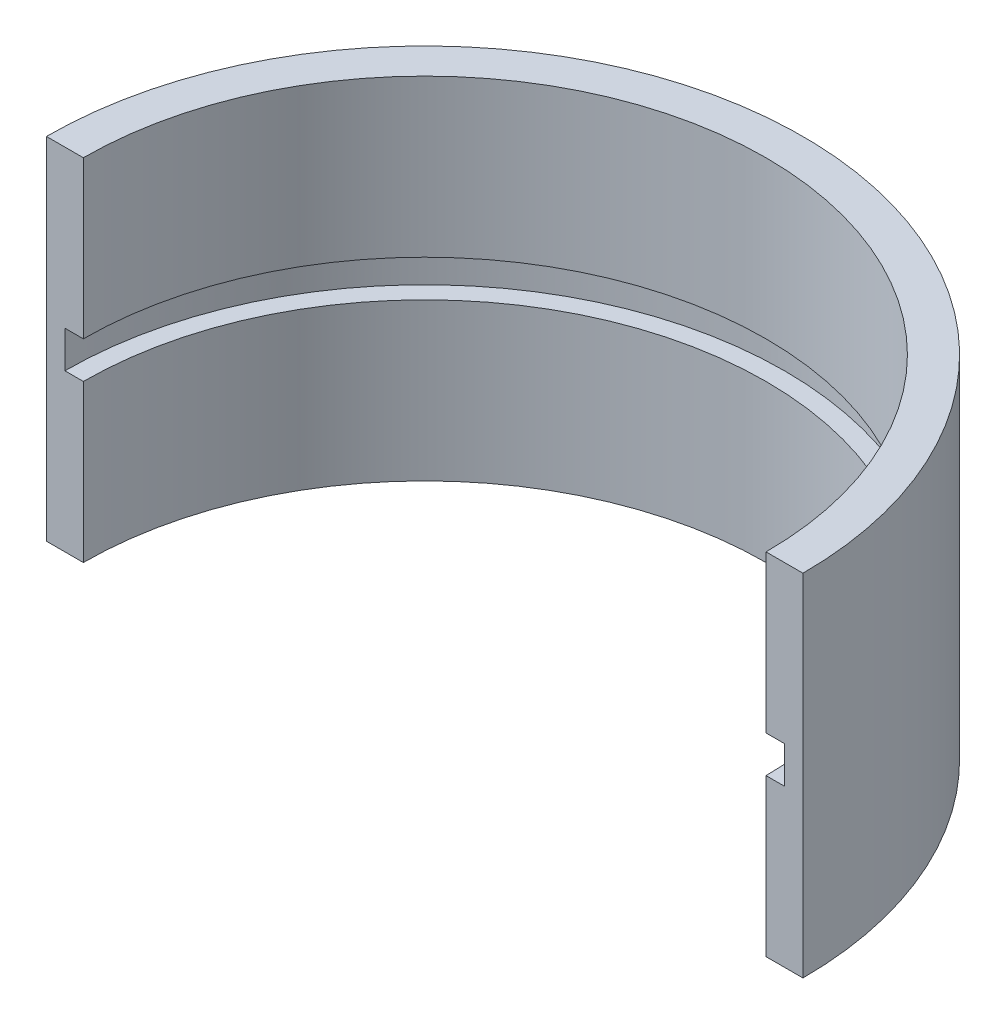
ISO-10303-21;
HEADER;
FILE_DESCRIPTION(('STEP AP214'),'2;1');
FILE_NAME('part.step','',(''),(''),'','','');
FILE_SCHEMA(('AUTOMOTIVE_DESIGN { 1 0 10303 214 1 1 1 1 }'));
ENDSEC;
DATA;
#1=APPLICATION_CONTEXT('core data for automotive mechanical design processes');
#2=APPLICATION_PROTOCOL_DEFINITION('international standard','automotive_design',2000,#1);
#3=PRODUCT_CONTEXT('',#1,'mechanical');
#4=PRODUCT('Part','Part','',(#3));
#5=PRODUCT_RELATED_PRODUCT_CATEGORY('part','',(#4));
#6=PRODUCT_DEFINITION_FORMATION('','',#4);
#7=PRODUCT_DEFINITION_CONTEXT('part definition',#1,'design');
#8=PRODUCT_DEFINITION('design','',#6,#7);
#9=PRODUCT_DEFINITION_SHAPE('','',#8);
#10=(LENGTH_UNIT() NAMED_UNIT(*) SI_UNIT(.MILLI.,.METRE.));
#11=(NAMED_UNIT(*) PLANE_ANGLE_UNIT() SI_UNIT($,.RADIAN.));
#12=(NAMED_UNIT(*) SI_UNIT($,.STERADIAN.) SOLID_ANGLE_UNIT());
#13=UNCERTAINTY_MEASURE_WITH_UNIT(LENGTH_MEASURE(1.E-05),#10,'distance_accuracy_value','');
#14=(GEOMETRIC_REPRESENTATION_CONTEXT(3) GLOBAL_UNCERTAINTY_ASSIGNED_CONTEXT((#13)) GLOBAL_UNIT_ASSIGNED_CONTEXT((#10,
#11,#12)) REPRESENTATION_CONTEXT('',''));
#15=CARTESIAN_POINT('',(0.,0.,0.));
#16=DIRECTION('',(0.,0.,1.));
#17=DIRECTION('',(1.,0.,0.));
#18=AXIS2_PLACEMENT_3D('',#15,#16,#17);
#19=CARTESIAN_POINT('',(0.,8.5,0.));
#20=DIRECTION('',(0.,1.,0.));
#21=DIRECTION('',(0.,0.,1.));
#22=AXIS2_PLACEMENT_3D('',#19,#20,#21);
#23=PLANE('',#22);
#24=CARTESIAN_POINT('',(0.,8.5,0.));
#25=DIRECTION('',(0.,-1.,0.));
#26=DIRECTION('',(0.,0.,1.));
#27=AXIS2_PLACEMENT_3D('',#24,#25,#26);
#28=CIRCLE('',#27,19.5);
#29=CARTESIAN_POINT('',(-19.5,8.5,0.));
#30=VERTEX_POINT('',#29);
#31=CARTESIAN_POINT('',(19.5,8.5,0.));
#32=VERTEX_POINT('',#31);
#33=EDGE_CURVE('E61',#30,#32,#28,.T.);
#34=ORIENTED_EDGE('',*,*,#33,.F.);
#35=DIRECTION('',(1.,0.,0.));
#36=VECTOR('',#35,1.);
#37=CARTESIAN_POINT('',(0.,8.5,0.));
#38=LINE('',#37,#36);
#39=CARTESIAN_POINT('',(-18.5,8.5,0.));
#40=VERTEX_POINT('',#39);
#41=EDGE_CURVE('E115',#30,#40,#38,.T.);
#42=ORIENTED_EDGE('',*,*,#41,.T.);
#43=CARTESIAN_POINT('',(0.,8.5,0.));
#44=DIRECTION('',(0.,1.,0.));
#45=DIRECTION('',(0.,0.,1.));
#46=AXIS2_PLACEMENT_3D('',#43,#44,#45);
#47=CIRCLE('',#46,18.5);
#48=CARTESIAN_POINT('',(18.5,8.5,0.));
#49=VERTEX_POINT('',#48);
#50=EDGE_CURVE('E96',#49,#40,#47,.T.);
#51=ORIENTED_EDGE('',*,*,#50,.F.);
#52=EDGE_CURVE('E92',#49,#32,#38,.T.);
#53=ORIENTED_EDGE('',*,*,#52,.T.);
#54=EDGE_LOOP('',(#34,#42,#51,#53));
#55=FACE_BOUND('',#54,.T.);
#56=ADVANCED_FACE('F45',(#55),#23,.T.);
#57=CARTESIAN_POINT('',(0.,8.5,0.));
#58=DIRECTION('',(0.,0.,-1.));
#59=DIRECTION('',(-1.,0.,0.));
#60=AXIS2_PLACEMENT_3D('',#57,#58,#59);
#61=PLANE('',#60);
#62=DIRECTION('',(1.,0.,0.));
#63=VECTOR('',#62,1.);
#64=CARTESIAN_POINT('',(0.,0.,0.));
#65=LINE('',#64,#63);
#66=CARTESIAN_POINT('',(18.5,0.,0.));
#67=VERTEX_POINT('',#66);
#68=CARTESIAN_POINT('',(20.5,0.,0.));
#69=VERTEX_POINT('',#68);
#70=EDGE_CURVE('E90',#67,#69,#65,.T.);
#71=ORIENTED_EDGE('',*,*,#70,.T.);
#72=DIRECTION('',(0.,-1.,0.));
#73=VECTOR('',#72,1.);
#74=CARTESIAN_POINT('',(20.5,8.5,0.));
#75=LINE('',#74,#73);
#76=CARTESIAN_POINT('',(20.5,19.,0.));
#77=VERTEX_POINT('',#76);
#78=EDGE_CURVE('E11',#77,#69,#75,.T.);
#79=ORIENTED_EDGE('',*,*,#78,.F.);
#80=DIRECTION('',(1.,0.,0.));
#81=VECTOR('',#80,1.);
#82=CARTESIAN_POINT('',(18.5,19.,0.));
#83=LINE('',#82,#81);
#84=CARTESIAN_POINT('',(18.5,19.,0.));
#85=VERTEX_POINT('',#84);
#86=EDGE_CURVE('E189',#85,#77,#83,.T.);
#87=ORIENTED_EDGE('',*,*,#86,.F.);
#88=DIRECTION('',(0.,-1.,0.));
#89=VECTOR('',#88,1.);
#90=CARTESIAN_POINT('',(18.5,19.,0.));
#91=LINE('',#90,#89);
#92=CARTESIAN_POINT('',(18.5,10.5,0.));
#93=VERTEX_POINT('',#92);
#94=EDGE_CURVE('E194',#85,#93,#91,.T.);
#95=ORIENTED_EDGE('',*,*,#94,.T.);
#96=DIRECTION('',(1.,0.,0.));
#97=VECTOR('',#96,1.);
#98=CARTESIAN_POINT('',(18.5,10.5,0.));
#99=LINE('',#98,#97);
#100=CARTESIAN_POINT('',(19.5,10.5,0.));
#101=VERTEX_POINT('',#100);
#102=EDGE_CURVE('E167',#93,#101,#99,.T.);
#103=ORIENTED_EDGE('',*,*,#102,.T.);
#104=DIRECTION('',(0.,-1.,0.));
#105=VECTOR('',#104,1.);
#106=CARTESIAN_POINT('',(19.5,10.5,0.));
#107=LINE('',#106,#105);
#108=EDGE_CURVE('E158',#101,#32,#107,.T.);
#109=ORIENTED_EDGE('',*,*,#108,.T.);
#110=ORIENTED_EDGE('',*,*,#52,.F.);
#111=DIRECTION('',(0.,-1.,0.));
#112=VECTOR('',#111,1.);
#113=CARTESIAN_POINT('',(18.5,8.5,0.));
#114=LINE('',#113,#112);
#115=EDGE_CURVE('E70',#49,#67,#114,.T.);
#116=ORIENTED_EDGE('',*,*,#115,.T.);
#117=EDGE_LOOP('',(#71,#79,#87,#95,#103,#109,#110,#116));
#118=FACE_BOUND('',#117,.T.);
#119=ADVANCED_FACE('F88',(#118),#61,.F.);
#120=CARTESIAN_POINT('',(0.,8.5,0.));
#121=DIRECTION('',(0.,-1.,0.));
#122=DIRECTION('',(0.,0.,-1.));
#123=AXIS2_PLACEMENT_3D('',#120,#121,#122);
#124=CYLINDRICAL_SURFACE('',#123,20.5);
#125=CARTESIAN_POINT('',(0.,0.,0.));
#126=DIRECTION('',(0.,1.,0.));
#127=DIRECTION('',(0.,0.,1.));
#128=AXIS2_PLACEMENT_3D('',#125,#126,#127);
#129=CIRCLE('',#128,20.5);
#130=CARTESIAN_POINT('',(-20.5,0.,0.));
#131=VERTEX_POINT('',#130);
#132=EDGE_CURVE('E103',#69,#131,#129,.T.);
#133=ORIENTED_EDGE('',*,*,#132,.T.);
#134=DIRECTION('',(0.,-1.,0.));
#135=VECTOR('',#134,1.);
#136=CARTESIAN_POINT('',(-20.5,8.5,0.));
#137=LINE('',#136,#135);
#138=CARTESIAN_POINT('',(-20.5,19.,0.));
#139=VERTEX_POINT('',#138);
#140=EDGE_CURVE('E54',#139,#131,#137,.T.);
#141=ORIENTED_EDGE('',*,*,#140,.F.);
#142=CARTESIAN_POINT('',(0.,19.,0.));
#143=DIRECTION('',(0.,1.,0.));
#144=DIRECTION('',(0.,0.,1.));
#145=AXIS2_PLACEMENT_3D('',#142,#143,#144);
#146=CIRCLE('',#145,20.5);
#147=EDGE_CURVE('E134',#77,#139,#146,.T.);
#148=ORIENTED_EDGE('',*,*,#147,.F.);
#149=ORIENTED_EDGE('',*,*,#78,.T.);
#150=EDGE_LOOP('',(#133,#141,#148,#149));
#151=FACE_BOUND('',#150,.T.);
#152=ADVANCED_FACE('F47',(#151),#124,.T.);
#153=CARTESIAN_POINT('',(-18.5,0.,0.));
#154=VERTEX_POINT('',#153);
#155=EDGE_CURVE('E107',#131,#154,#65,.T.);
#156=ORIENTED_EDGE('',*,*,#155,.T.);
#157=DIRECTION('',(0.,-1.,0.));
#158=VECTOR('',#157,1.);
#159=CARTESIAN_POINT('',(-18.5,8.5,0.));
#160=LINE('',#159,#158);
#161=EDGE_CURVE('E95',#40,#154,#160,.T.);
#162=ORIENTED_EDGE('',*,*,#161,.F.);
#163=ORIENTED_EDGE('',*,*,#41,.F.);
#164=DIRECTION('',(0.,-1.,0.));
#165=VECTOR('',#164,1.);
#166=CARTESIAN_POINT('',(-19.5,10.5,0.));
#167=LINE('',#166,#165);
#168=CARTESIAN_POINT('',(-19.5,10.5,0.));
#169=VERTEX_POINT('',#168);
#170=EDGE_CURVE('E105',#169,#30,#167,.T.);
#171=ORIENTED_EDGE('',*,*,#170,.F.);
#172=DIRECTION('',(1.,0.,0.));
#173=VECTOR('',#172,1.);
#174=CARTESIAN_POINT('',(-20.5,10.5,0.));
#175=LINE('',#174,#173);
#176=CARTESIAN_POINT('',(-18.5,10.5,0.));
#177=VERTEX_POINT('',#176);
#178=EDGE_CURVE('E178',#169,#177,#175,.T.);
#179=ORIENTED_EDGE('',*,*,#178,.T.);
#180=DIRECTION('',(0.,-1.,0.));
#181=VECTOR('',#180,1.);
#182=CARTESIAN_POINT('',(-18.5,19.,0.));
#183=LINE('',#182,#181);
#184=CARTESIAN_POINT('',(-18.5,19.,0.));
#185=VERTEX_POINT('',#184);
#186=EDGE_CURVE('E162',#185,#177,#183,.T.);
#187=ORIENTED_EDGE('',*,*,#186,.F.);
#188=DIRECTION('',(1.,0.,0.));
#189=VECTOR('',#188,1.);
#190=CARTESIAN_POINT('',(-20.5,19.,0.));
#191=LINE('',#190,#189);
#192=EDGE_CURVE('E129',#139,#185,#191,.T.);
#193=ORIENTED_EDGE('',*,*,#192,.F.);
#194=ORIENTED_EDGE('',*,*,#140,.T.);
#195=EDGE_LOOP('',(#156,#162,#163,#171,#179,#187,#193,#194));
#196=FACE_BOUND('',#195,.T.);
#197=ADVANCED_FACE('F125',(#196),#61,.F.);
#198=CARTESIAN_POINT('',(0.,8.5,0.));
#199=DIRECTION('',(0.,-1.,0.));
#200=DIRECTION('',(0.,0.,-1.));
#201=AXIS2_PLACEMENT_3D('',#198,#199,#200);
#202=CYLINDRICAL_SURFACE('',#201,18.5);
#203=CARTESIAN_POINT('',(0.,0.,0.));
#204=DIRECTION('',(0.,1.,0.));
#205=DIRECTION('',(0.,0.,1.));
#206=AXIS2_PLACEMENT_3D('',#203,#204,#205);
#207=CIRCLE('',#206,18.5);
#208=EDGE_CURVE('E102',#67,#154,#207,.T.);
#209=ORIENTED_EDGE('',*,*,#208,.F.);
#210=ORIENTED_EDGE('',*,*,#115,.F.);
#211=ORIENTED_EDGE('',*,*,#50,.T.);
#212=ORIENTED_EDGE('',*,*,#161,.T.);
#213=EDGE_LOOP('',(#209,#210,#211,#212));
#214=FACE_BOUND('',#213,.T.);
#215=ADVANCED_FACE('F108',(#214),#202,.F.);
#216=CARTESIAN_POINT('',(0.,0.,0.));
#217=DIRECTION('',(0.,1.,0.));
#218=DIRECTION('',(0.,0.,1.));
#219=AXIS2_PLACEMENT_3D('',#216,#217,#218);
#220=PLANE('',#219);
#221=ORIENTED_EDGE('',*,*,#70,.F.);
#222=ORIENTED_EDGE('',*,*,#208,.T.);
#223=ORIENTED_EDGE('',*,*,#155,.F.);
#224=ORIENTED_EDGE('',*,*,#132,.F.);
#225=EDGE_LOOP('',(#221,#222,#223,#224));
#226=FACE_BOUND('',#225,.T.);
#227=ADVANCED_FACE('F100',(#226),#220,.F.);
#228=CARTESIAN_POINT('',(0.,10.5,0.));
#229=DIRECTION('',(0.,-1.,0.));
#230=DIRECTION('',(0.,0.,-1.));
#231=AXIS2_PLACEMENT_3D('',#228,#229,#230);
#232=CYLINDRICAL_SURFACE('',#231,19.5);
#233=ORIENTED_EDGE('',*,*,#33,.T.);
#234=ORIENTED_EDGE('',*,*,#108,.F.);
#235=CARTESIAN_POINT('',(0.,10.5,0.));
#236=DIRECTION('',(0.,-1.,0.));
#237=DIRECTION('',(0.,0.,1.));
#238=AXIS2_PLACEMENT_3D('',#235,#236,#237);
#239=CIRCLE('',#238,19.5);
#240=EDGE_CURVE('E161',#169,#101,#239,.T.);
#241=ORIENTED_EDGE('',*,*,#240,.F.);
#242=ORIENTED_EDGE('',*,*,#170,.T.);
#243=EDGE_LOOP('',(#233,#234,#241,#242));
#244=FACE_BOUND('',#243,.T.);
#245=ADVANCED_FACE('F156',(#244),#232,.F.);
#246=CARTESIAN_POINT('',(0.,10.5,0.));
#247=DIRECTION('',(0.,1.,0.));
#248=DIRECTION('',(0.,0.,1.));
#249=AXIS2_PLACEMENT_3D('',#246,#247,#248);
#250=PLANE('',#249);
#251=ORIENTED_EDGE('',*,*,#178,.F.);
#252=ORIENTED_EDGE('',*,*,#240,.T.);
#253=ORIENTED_EDGE('',*,*,#102,.F.);
#254=CARTESIAN_POINT('',(0.,10.5,0.));
#255=DIRECTION('',(0.,-1.,0.));
#256=DIRECTION('',(0.,0.,1.));
#257=AXIS2_PLACEMENT_3D('',#254,#255,#256);
#258=CIRCLE('',#257,18.5);
#259=EDGE_CURVE('E183',#177,#93,#258,.T.);
#260=ORIENTED_EDGE('',*,*,#259,.F.);
#261=EDGE_LOOP('',(#251,#252,#253,#260));
#262=FACE_BOUND('',#261,.T.);
#263=ADVANCED_FACE('F182',(#262),#250,.F.);
#264=CARTESIAN_POINT('',(0.,19.,0.));
#265=DIRECTION('',(0.,-1.,0.));
#266=DIRECTION('',(0.,0.,-1.));
#267=AXIS2_PLACEMENT_3D('',#264,#265,#266);
#268=CYLINDRICAL_SURFACE('',#267,18.5);
#269=ORIENTED_EDGE('',*,*,#259,.T.);
#270=ORIENTED_EDGE('',*,*,#94,.F.);
#271=CARTESIAN_POINT('',(0.,19.,0.));
#272=DIRECTION('',(0.,-1.,0.));
#273=DIRECTION('',(0.,0.,1.));
#274=AXIS2_PLACEMENT_3D('',#271,#272,#273);
#275=CIRCLE('',#274,18.5);
#276=EDGE_CURVE('E202',#185,#85,#275,.T.);
#277=ORIENTED_EDGE('',*,*,#276,.F.);
#278=ORIENTED_EDGE('',*,*,#186,.T.);
#279=EDGE_LOOP('',(#269,#270,#277,#278));
#280=FACE_BOUND('',#279,.T.);
#281=ADVANCED_FACE('F200',(#280),#268,.F.);
#282=CARTESIAN_POINT('',(0.,19.,0.));
#283=DIRECTION('',(0.,1.,0.));
#284=DIRECTION('',(0.,0.,1.));
#285=AXIS2_PLACEMENT_3D('',#282,#283,#284);
#286=PLANE('',#285);
#287=ORIENTED_EDGE('',*,*,#147,.T.);
#288=ORIENTED_EDGE('',*,*,#192,.T.);
#289=ORIENTED_EDGE('',*,*,#276,.T.);
#290=ORIENTED_EDGE('',*,*,#86,.T.);
#291=EDGE_LOOP('',(#287,#288,#289,#290));
#292=FACE_BOUND('',#291,.T.);
#293=ADVANCED_FACE('F212',(#292),#286,.T.);
#294=CLOSED_SHELL('',(#56,#119,#152,#197,#215,#227,#245,#263,#281,#293));
#295=MANIFOLD_SOLID_BREP('B2',#294);
#296=ADVANCED_BREP_SHAPE_REPRESENTATION('',(#18,#295),#14);
#297=SHAPE_DEFINITION_REPRESENTATION(#9,#296);
ENDSEC;
END-ISO-10303-21;
